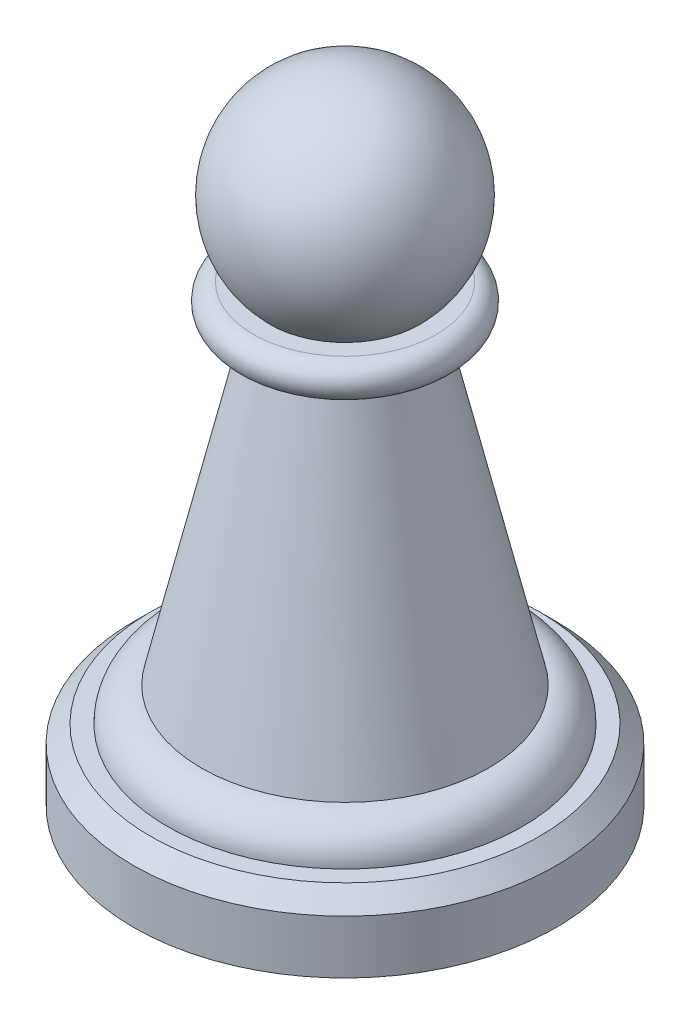
ISO-10303-21;
HEADER;
FILE_DESCRIPTION(('STEP AP214'),'2;1');
FILE_NAME('part.step','',(''),(''),'','','');
FILE_SCHEMA(('AUTOMOTIVE_DESIGN { 1 0 10303 214 1 1 1 1 }'));
ENDSEC;
DATA;
#1=APPLICATION_CONTEXT('core data for automotive mechanical design processes');
#2=APPLICATION_PROTOCOL_DEFINITION('international standard','automotive_design',2000,#1);
#3=PRODUCT_CONTEXT('',#1,'mechanical');
#4=PRODUCT('Part','Part','',(#3));
#5=PRODUCT_RELATED_PRODUCT_CATEGORY('part','',(#4));
#6=PRODUCT_DEFINITION_FORMATION('','',#4);
#7=PRODUCT_DEFINITION_CONTEXT('part definition',#1,'design');
#8=PRODUCT_DEFINITION('design','',#6,#7);
#9=PRODUCT_DEFINITION_SHAPE('','',#8);
#10=(LENGTH_UNIT() NAMED_UNIT(*) SI_UNIT(.MILLI.,.METRE.));
#11=(NAMED_UNIT(*) PLANE_ANGLE_UNIT() SI_UNIT($,.RADIAN.));
#12=(NAMED_UNIT(*) SI_UNIT($,.STERADIAN.) SOLID_ANGLE_UNIT());
#13=UNCERTAINTY_MEASURE_WITH_UNIT(LENGTH_MEASURE(1.E-05),#10,'distance_accuracy_value','');
#14=(GEOMETRIC_REPRESENTATION_CONTEXT(3) GLOBAL_UNCERTAINTY_ASSIGNED_CONTEXT((#13)) GLOBAL_UNIT_ASSIGNED_CONTEXT((#10,
#11,#12)) REPRESENTATION_CONTEXT('',''));
#15=CARTESIAN_POINT('',(0.,0.,0.));
#16=DIRECTION('',(0.,0.,1.));
#17=DIRECTION('',(1.,0.,0.));
#18=AXIS2_PLACEMENT_3D('',#15,#16,#17);
#19=CARTESIAN_POINT('',(0.,0.,0.));
#20=DIRECTION('',(0.,1.,0.));
#21=DIRECTION('',(0.,0.,1.));
#22=AXIS2_PLACEMENT_3D('',#19,#20,#21);
#23=PLANE('',#22);
#24=CARTESIAN_POINT('',(0.,0.,0.));
#25=DIRECTION('',(0.,-1.,0.));
#26=DIRECTION('',(0.,0.,-1.));
#27=AXIS2_PLACEMENT_3D('',#24,#25,#26);
#28=CIRCLE('',#27,9.525);
#29=CARTESIAN_POINT('',(0.,0.,-9.525));
#30=VERTEX_POINT('',#29);
#31=EDGE_CURVE('E48',#30,#30,#28,.T.);
#32=ORIENTED_EDGE('',*,*,#31,.T.);
#33=EDGE_LOOP('',(#32));
#34=FACE_BOUND('',#33,.T.);
#35=ADVANCED_FACE('F36',(#34),#23,.F.);
#36=CARTESIAN_POINT('',(0.,0.,0.));
#37=DIRECTION('',(0.,-1.,0.));
#38=DIRECTION('',(0.,0.,-1.));
#39=AXIS2_PLACEMENT_3D('',#36,#37,#38);
#40=CYLINDRICAL_SURFACE('',#39,9.525);
#41=CARTESIAN_POINT('',(0.,2.413,0.));
#42=DIRECTION('',(0.,-1.,0.));
#43=DIRECTION('',(0.,0.,-1.));
#44=AXIS2_PLACEMENT_3D('',#41,#42,#43);
#45=CIRCLE('',#44,9.525);
#46=CARTESIAN_POINT('',(0.,2.413,-9.525));
#47=VERTEX_POINT('',#46);
#48=EDGE_CURVE('E44',#47,#47,#45,.T.);
#49=ORIENTED_EDGE('',*,*,#48,.T.);
#50=EDGE_LOOP('',(#49));
#51=FACE_BOUND('',#50,.T.);
#52=ORIENTED_EDGE('',*,*,#31,.F.);
#53=EDGE_LOOP('',(#52));
#54=FACE_BOUND('',#53,.T.);
#55=ADVANCED_FACE('F88',(#51,#54),#40,.T.);
#56=CARTESIAN_POINT('',(-9.525,3.175,0.));
#57=DIRECTION('',(0.,-1.,0.));
#58=DIRECTION('',(0.,0.,-1.));
#59=AXIS2_PLACEMENT_3D('',#56,#57,#58);
#60=PLANE('',#59);
#61=CARTESIAN_POINT('',(0.,3.175,0.));
#62=DIRECTION('',(0.,-1.,0.));
#63=DIRECTION('',(0.,0.,-1.));
#64=AXIS2_PLACEMENT_3D('',#61,#62,#63);
#65=CIRCLE('',#64,8.763);
#66=CARTESIAN_POINT('',(0.,3.175,-8.763));
#67=VERTEX_POINT('',#66);
#68=EDGE_CURVE('E10',#67,#67,#65,.F.);
#69=ORIENTED_EDGE('',*,*,#68,.T.);
#70=EDGE_LOOP('',(#69));
#71=FACE_BOUND('',#70,.T.);
#72=CARTESIAN_POINT('',(0.,3.175,0.));
#73=DIRECTION('',(0.,-1.,0.));
#74=DIRECTION('',(0.,0.,-1.));
#75=AXIS2_PLACEMENT_3D('',#72,#73,#74);
#76=CIRCLE('',#75,8.001);
#77=CARTESIAN_POINT('',(0.,3.175,-8.001));
#78=VERTEX_POINT('',#77);
#79=EDGE_CURVE('E52',#78,#78,#76,.T.);
#80=ORIENTED_EDGE('',*,*,#79,.T.);
#81=EDGE_LOOP('',(#80));
#82=FACE_BOUND('',#81,.T.);
#83=ADVANCED_FACE('F94',(#71,#82),#60,.F.);
#84=CARTESIAN_POINT('',(0.,18.923,0.));
#85=DIRECTION('',(0.,-1.,0.));
#86=DIRECTION('',(0.,0.,-1.));
#87=AXIS2_PLACEMENT_3D('',#84,#85,#86);
#88=CONICAL_SURFACE('',#87,3.175,0.228102628279942);
#89=CARTESIAN_POINT('',(0.,4.699,0.));
#90=DIRECTION('',(0.,-1.,0.));
#91=DIRECTION('',(0.,0.,-1.));
#92=AXIS2_PLACEMENT_3D('',#89,#90,#91);
#93=CIRCLE('',#92,6.477);
#94=CARTESIAN_POINT('',(0.,4.699,-6.477));
#95=VERTEX_POINT('',#94);
#96=EDGE_CURVE('E57',#95,#95,#93,.T.);
#97=ORIENTED_EDGE('',*,*,#96,.F.);
#98=EDGE_LOOP('',(#97));
#99=FACE_BOUND('',#98,.T.);
#100=CARTESIAN_POINT('',(0.,18.923,0.));
#101=DIRECTION('',(0.,-1.,0.));
#102=DIRECTION('',(0.,0.,-1.));
#103=AXIS2_PLACEMENT_3D('',#100,#101,#102);
#104=CIRCLE('',#103,3.175);
#105=CARTESIAN_POINT('',(0.,18.923,-3.175));
#106=VERTEX_POINT('',#105);
#107=EDGE_CURVE('E60',#106,#106,#104,.T.);
#108=ORIENTED_EDGE('',*,*,#107,.T.);
#109=EDGE_LOOP('',(#108));
#110=FACE_BOUND('',#109,.T.);
#111=ADVANCED_FACE('F99',(#99,#110),#88,.T.);
#112=CARTESIAN_POINT('',(-3.175,18.923,0.));
#113=DIRECTION('',(0.,1.,0.));
#114=DIRECTION('',(0.,0.,1.));
#115=AXIS2_PLACEMENT_3D('',#112,#113,#114);
#116=PLANE('',#115);
#117=ORIENTED_EDGE('',*,*,#107,.F.);
#118=EDGE_LOOP('',(#117));
#119=FACE_BOUND('',#118,.T.);
#120=CARTESIAN_POINT('',(0.,18.923,0.));
#121=DIRECTION('',(0.,-1.,0.));
#122=DIRECTION('',(0.,0.,-1.));
#123=AXIS2_PLACEMENT_3D('',#120,#121,#122);
#124=CIRCLE('',#123,4.1316907870011);
#125=CARTESIAN_POINT('',(0.,18.923,-4.1316907870011));
#126=VERTEX_POINT('',#125);
#127=EDGE_CURVE('E63',#126,#126,#124,.T.);
#128=ORIENTED_EDGE('',*,*,#127,.T.);
#129=EDGE_LOOP('',(#128));
#130=FACE_BOUND('',#129,.T.);
#131=ADVANCED_FACE('F102',(#119,#130),#116,.F.);
#132=CARTESIAN_POINT('',(0.,19.685,0.));
#133=DIRECTION('',(0.,-1.,0.));
#134=DIRECTION('',(0.,0.,-1.));
#135=AXIS2_PLACEMENT_3D('',#132,#133,#134);
#136=TOROIDAL_SURFACE('',#135,4.1316907870011,0.762000000000001);
#137=ORIENTED_EDGE('',*,*,#127,.F.);
#138=EDGE_LOOP('',(#137));
#139=FACE_BOUND('',#138,.T.);
#140=CARTESIAN_POINT('',(0.,20.447,0.));
#141=DIRECTION('',(0.,-1.,0.));
#142=DIRECTION('',(0.,0.,-1.));
#143=AXIS2_PLACEMENT_3D('',#140,#141,#142);
#144=CIRCLE('',#143,4.1316907870011);
#145=CARTESIAN_POINT('',(0.,20.447,-4.1316907870011));
#146=VERTEX_POINT('',#145);
#147=EDGE_CURVE('E66',#146,#146,#144,.T.);
#148=ORIENTED_EDGE('',*,*,#147,.T.);
#149=EDGE_LOOP('',(#148));
#150=FACE_BOUND('',#149,.T.);
#151=ADVANCED_FACE('F84',(#139,#150),#136,.T.);
#152=CARTESIAN_POINT('',(-4.1316907870011,20.447,0.));
#153=DIRECTION('',(0.,-1.,0.));
#154=DIRECTION('',(0.,0.,-1.));
#155=AXIS2_PLACEMENT_3D('',#152,#153,#154);
#156=PLANE('',#155);
#157=ORIENTED_EDGE('',*,*,#147,.F.);
#158=EDGE_LOOP('',(#157));
#159=FACE_BOUND('',#158,.T.);
#160=CARTESIAN_POINT('',(0.,20.447,0.));
#161=DIRECTION('',(0.,-1.,0.));
#162=DIRECTION('',(0.,0.,-1.));
#163=AXIS2_PLACEMENT_3D('',#160,#161,#162);
#164=CIRCLE('',#163,3.36969078700109);
#165=CARTESIAN_POINT('',(0.,20.447,-3.36969078700109));
#166=VERTEX_POINT('',#165);
#167=EDGE_CURVE('E69',#166,#166,#164,.T.);
#168=ORIENTED_EDGE('',*,*,#167,.T.);
#169=EDGE_LOOP('',(#168));
#170=FACE_BOUND('',#169,.T.);
#171=ADVANCED_FACE('F73',(#159,#170),#156,.F.);
#172=CARTESIAN_POINT('',(0.,23.8125,0.));
#173=DIRECTION('',(0.,-1.,0.));
#174=DIRECTION('',(1.,0.,0.));
#175=AXIS2_PLACEMENT_3D('',#172,#173,#174);
#176=SPHERICAL_SURFACE('',#175,4.7625);
#177=ORIENTED_EDGE('',*,*,#167,.F.);
#178=EDGE_LOOP('',(#177));
#179=FACE_BOUND('',#178,.T.);
#180=ADVANCED_FACE('F75',(#179),#176,.T.);
#181=CARTESIAN_POINT('',(0.,3.175,0.));
#182=DIRECTION('',(0.,-1.,0.));
#183=DIRECTION('',(0.,0.,-1.));
#184=AXIS2_PLACEMENT_3D('',#181,#182,#183);
#185=TOROIDAL_SURFACE('',#184,6.477,1.524);
#186=ORIENTED_EDGE('',*,*,#96,.T.);
#187=EDGE_LOOP('',(#186));
#188=FACE_BOUND('',#187,.T.);
#189=ORIENTED_EDGE('',*,*,#79,.F.);
#190=EDGE_LOOP('',(#189));
#191=FACE_BOUND('',#190,.T.);
#192=ADVANCED_FACE('F77',(#188,#191),#185,.T.);
#193=CARTESIAN_POINT('',(0.,2.413,0.));
#194=DIRECTION('',(0.,-1.,0.));
#195=DIRECTION('',(0.,0.,-1.));
#196=AXIS2_PLACEMENT_3D('',#193,#194,#195);
#197=CONICAL_SURFACE('',#196,9.525,0.785398163397451);
#198=CARTESIAN_POINT('',(0.,3.175,-8.763));
#199=CARTESIAN_POINT('',(0.,3.1670625,-8.7709375));
#200=CARTESIAN_POINT('',(0.,3.159125,-8.778875));
#201=CARTESIAN_POINT('',(0.,3.14325,-8.79475));
#202=CARTESIAN_POINT('',(0.,3.1353125,-8.8026875));
#203=CARTESIAN_POINT('',(0.,3.1194375,-8.8185625));
#204=CARTESIAN_POINT('',(0.,3.1115,-8.8265));
#205=CARTESIAN_POINT('',(0.,3.095625,-8.842375));
#206=CARTESIAN_POINT('',(0.,3.0876875,-8.8503125));
#207=CARTESIAN_POINT('',(0.,3.0718125,-8.8661875));
#208=CARTESIAN_POINT('',(0.,3.063875,-8.874125));
#209=CARTESIAN_POINT('',(0.,3.048,-8.89));
#210=CARTESIAN_POINT('',(0.,3.0400625,-8.8979375));
#211=CARTESIAN_POINT('',(0.,3.0241875,-8.9138125));
#212=CARTESIAN_POINT('',(0.,3.01625,-8.92175));
#213=CARTESIAN_POINT('',(0.,3.000375,-8.937625));
#214=CARTESIAN_POINT('',(0.,2.9924375,-8.9455625));
#215=CARTESIAN_POINT('',(0.,2.9765625,-8.9614375));
#216=CARTESIAN_POINT('',(0.,2.968625,-8.969375));
#217=CARTESIAN_POINT('',(0.,2.95275,-8.98525));
#218=CARTESIAN_POINT('',(0.,2.9448125,-8.9931875));
#219=CARTESIAN_POINT('',(0.,2.9289375,-9.0090625));
#220=CARTESIAN_POINT('',(0.,2.921,-9.017));
#221=CARTESIAN_POINT('',(0.,2.905125,-9.032875));
#222=CARTESIAN_POINT('',(0.,2.8971875,-9.0408125));
#223=CARTESIAN_POINT('',(0.,2.8813125,-9.0566875));
#224=CARTESIAN_POINT('',(0.,2.873375,-9.064625));
#225=CARTESIAN_POINT('',(0.,2.8575,-9.0805));
#226=CARTESIAN_POINT('',(0.,2.8495625,-9.0884375));
#227=CARTESIAN_POINT('',(0.,2.8336875,-9.1043125));
#228=CARTESIAN_POINT('',(0.,2.82575,-9.11225));
#229=CARTESIAN_POINT('',(0.,2.809875,-9.128125));
#230=CARTESIAN_POINT('',(0.,2.8019375,-9.1360625));
#231=CARTESIAN_POINT('',(0.,2.7860625,-9.1519375));
#232=CARTESIAN_POINT('',(0.,2.778125,-9.159875));
#233=CARTESIAN_POINT('',(0.,2.76225,-9.17575));
#234=CARTESIAN_POINT('',(0.,2.7543125,-9.1836875));
#235=CARTESIAN_POINT('',(0.,2.7384375,-9.1995625));
#236=CARTESIAN_POINT('',(0.,2.7305,-9.2075));
#237=CARTESIAN_POINT('',(0.,2.714625,-9.223375));
#238=CARTESIAN_POINT('',(0.,2.7066875,-9.2313125));
#239=CARTESIAN_POINT('',(0.,2.6908125,-9.2471875));
#240=CARTESIAN_POINT('',(0.,2.682875,-9.255125));
#241=CARTESIAN_POINT('',(0.,2.667,-9.271));
#242=CARTESIAN_POINT('',(0.,2.6590625,-9.2789375));
#243=CARTESIAN_POINT('',(0.,2.6431875,-9.2948125));
#244=CARTESIAN_POINT('',(0.,2.63525,-9.30275));
#245=CARTESIAN_POINT('',(0.,2.619375,-9.318625));
#246=CARTESIAN_POINT('',(0.,2.6114375,-9.3265625));
#247=CARTESIAN_POINT('',(0.,2.5955625,-9.3424375));
#248=CARTESIAN_POINT('',(0.,2.587625,-9.350375));
#249=CARTESIAN_POINT('',(0.,2.57175,-9.36625));
#250=CARTESIAN_POINT('',(0.,2.5638125,-9.3741875));
#251=CARTESIAN_POINT('',(0.,2.5479375,-9.3900625));
#252=CARTESIAN_POINT('',(0.,2.54,-9.398));
#253=CARTESIAN_POINT('',(0.,2.524125,-9.413875));
#254=CARTESIAN_POINT('',(0.,2.5161875,-9.4218125));
#255=CARTESIAN_POINT('',(0.,2.5003125,-9.4376875));
#256=CARTESIAN_POINT('',(0.,2.492375,-9.445625));
#257=CARTESIAN_POINT('',(0.,2.4765,-9.4615));
#258=CARTESIAN_POINT('',(0.,2.4685625,-9.4694375));
#259=CARTESIAN_POINT('',(0.,2.4526875,-9.4853125));
#260=CARTESIAN_POINT('',(0.,2.44475,-9.49325));
#261=CARTESIAN_POINT('',(0.,2.428875,-9.509125));
#262=CARTESIAN_POINT('',(0.,2.4209375,-9.5170625));
#263=CARTESIAN_POINT('',(0.,2.413,-9.525));
#264=B_SPLINE_CURVE_WITH_KNOTS('',3,(#198,#199,#200,#201,#202,#203,#204,#205,#206,#207,#208,
#209,#210,#211,#212,#213,#214,#215,#216,#217,#218,#219,#220,#221,#222,#223,#224,#225,#226,#227,
#228,#229,#230,#231,#232,#233,#234,#235,#236,#237,#238,#239,#240,#241,#242,#243,#244,#245,#246,
#247,#248,#249,#250,#251,#252,#253,#254,#255,#256,#257,#258,#259,#260,#261,#262,#263),
.UNSPECIFIED.,.F.,.F.,(4,2,2,2,2,2,2,2,2,2,2,2,2,2,2,2,2,2,2,2,2,2,2,2,2,2,2,2,2,2,2,2,4),(0.,
0.033675960454009,0.0673519209080182,0.101027881362028,0.134703841816037,0.168379802270046,
0.202055762724057,0.235731723178066,0.269407683632075,0.303083644086085,0.336759604540094,
0.370435564994103,0.404111525448113,0.437787485902122,0.471463446356132,0.505139406810141,
0.53881536726415,0.57249132771816,0.60616728817217,0.639843248626179,0.673519209080189,
0.707195169534198,0.740871129988207,0.774547090442217,0.808223050896226,0.841899011350235,
0.875574971804246,0.909250932258255,0.942926892712264,0.976602853166274,1.01027881362028,
1.04395477407429,1.0776307345283),.UNSPECIFIED.);
#265=EDGE_CURVE('BSEAM39',#67,#47,#264,.T.);
#266=ORIENTED_EDGE('',*,*,#68,.F.);
#267=ORIENTED_EDGE('',*,*,#48,.F.);
#268=ORIENTED_EDGE('',*,*,#265,.T.);
#269=ORIENTED_EDGE('',*,*,#265,.F.);
#270=EDGE_LOOP('',(#266,#268,#267,#269));
#271=FACE_BOUND('',#270,.T.);
#272=ADVANCED_FACE('F39',(#271),#197,.T.);
#273=CLOSED_SHELL('',(#35,#55,#83,#111,#131,#151,#171,#180,#192,#272));
#274=MANIFOLD_SOLID_BREP('B2',#273);
#275=ADVANCED_BREP_SHAPE_REPRESENTATION('',(#18,#274),#14);
#276=SHAPE_DEFINITION_REPRESENTATION(#9,#275);
ENDSEC;
END-ISO-10303-21;
